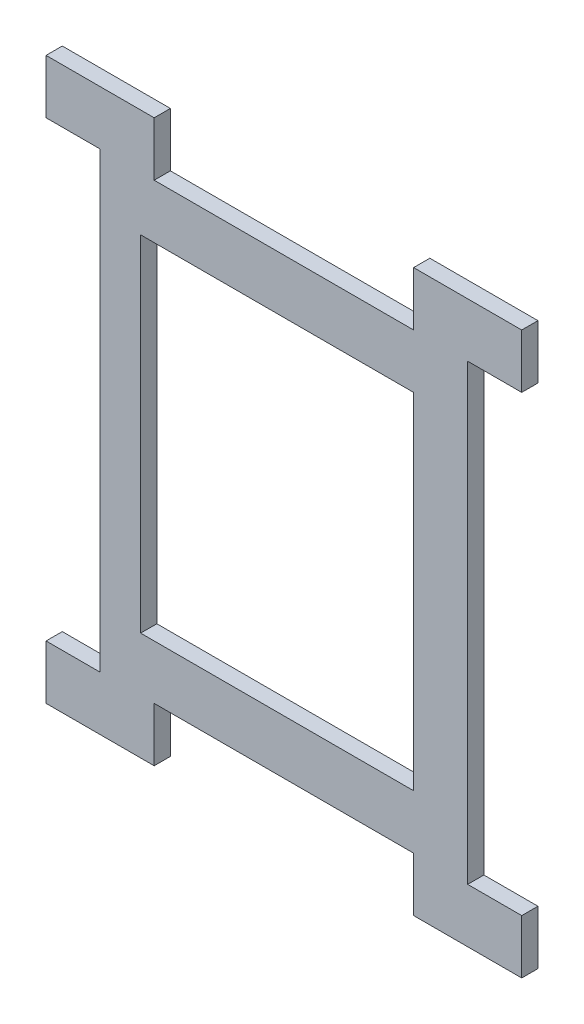
ISO-10303-21;
HEADER;
FILE_DESCRIPTION(('STEP AP214'),'2;1');
FILE_NAME('part.step','',(''),(''),'','','');
FILE_SCHEMA(('AUTOMOTIVE_DESIGN { 1 0 10303 214 1 1 1 1 }'));
ENDSEC;
DATA;
#1=APPLICATION_CONTEXT('core data for automotive mechanical design processes');
#2=APPLICATION_PROTOCOL_DEFINITION('international standard','automotive_design',2000,#1);
#3=PRODUCT_CONTEXT('',#1,'mechanical');
#4=PRODUCT('Part','Part','',(#3));
#5=PRODUCT_RELATED_PRODUCT_CATEGORY('part','',(#4));
#6=PRODUCT_DEFINITION_FORMATION('','',#4);
#7=PRODUCT_DEFINITION_CONTEXT('part definition',#1,'design');
#8=PRODUCT_DEFINITION('design','',#6,#7);
#9=PRODUCT_DEFINITION_SHAPE('','',#8);
#10=(LENGTH_UNIT() NAMED_UNIT(*) SI_UNIT(.MILLI.,.METRE.));
#11=(NAMED_UNIT(*) PLANE_ANGLE_UNIT() SI_UNIT($,.RADIAN.));
#12=(NAMED_UNIT(*) SI_UNIT($,.STERADIAN.) SOLID_ANGLE_UNIT());
#13=UNCERTAINTY_MEASURE_WITH_UNIT(LENGTH_MEASURE(1.E-05),#10,'distance_accuracy_value','');
#14=(GEOMETRIC_REPRESENTATION_CONTEXT(3) GLOBAL_UNCERTAINTY_ASSIGNED_CONTEXT((#13)) GLOBAL_UNIT_ASSIGNED_CONTEXT((#10,
#11,#12)) REPRESENTATION_CONTEXT('',''));
#15=CARTESIAN_POINT('',(0.,0.,0.));
#16=DIRECTION('',(0.,0.,1.));
#17=DIRECTION('',(1.,0.,0.));
#18=AXIS2_PLACEMENT_3D('',#15,#16,#17);
#19=CARTESIAN_POINT('',(-37.1907164276685,32.8972694424078,3.));
#20=DIRECTION('',(0.,0.,1.));
#21=DIRECTION('',(1.,0.,0.));
#22=AXIS2_PLACEMENT_3D('',#19,#20,#21);
#23=PLANE('',#22);
#24=DIRECTION('',(-1.,0.,0.));
#25=VECTOR('',#24,1.);
#26=CARTESIAN_POINT('',(-17.1907164276685,32.8972694424079,3.));
#27=LINE('',#26,#25);
#28=CARTESIAN_POINT('',(-17.1907164276685,32.8972694424079,3.));
#29=VERTEX_POINT('',#28);
#30=CARTESIAN_POINT('',(-37.1907164276685,32.8972694424078,3.));
#31=VERTEX_POINT('',#30);
#32=EDGE_CURVE('E230',#29,#31,#27,.T.);
#33=ORIENTED_EDGE('',*,*,#32,.T.);
#34=DIRECTION('',(0.,-1.,0.));
#35=VECTOR('',#34,1.);
#36=CARTESIAN_POINT('',(-37.1907164276685,32.8972694424078,3.));
#37=LINE('',#36,#35);
#38=CARTESIAN_POINT('',(-37.1907164276685,22.8972694424078,3.));
#39=VERTEX_POINT('',#38);
#40=EDGE_CURVE('E233',#31,#39,#37,.T.);
#41=ORIENTED_EDGE('',*,*,#40,.T.);
#42=DIRECTION('',(1.,0.,0.));
#43=VECTOR('',#42,1.);
#44=CARTESIAN_POINT('',(-37.1907164276685,22.8972694424078,3.));
#45=LINE('',#44,#43);
#46=CARTESIAN_POINT('',(-27.1907164276685,22.8972694424078,3.));
#47=VERTEX_POINT('',#46);
#48=EDGE_CURVE('E236',#39,#47,#45,.T.);
#49=ORIENTED_EDGE('',*,*,#48,.T.);
#50=DIRECTION('',(0.,-1.,0.));
#51=VECTOR('',#50,1.);
#52=CARTESIAN_POINT('',(-27.1907164276685,22.8972694424078,3.));
#53=LINE('',#52,#51);
#54=CARTESIAN_POINT('',(-27.1907164276685,-60.9121496064873,3.));
#55=VERTEX_POINT('',#54);
#56=EDGE_CURVE('E238',#47,#55,#53,.T.);
#57=ORIENTED_EDGE('',*,*,#56,.T.);
#58=DIRECTION('',(-1.,0.,0.));
#59=VECTOR('',#58,1.);
#60=CARTESIAN_POINT('',(-27.1907164276685,-60.9121496064873,3.));
#61=LINE('',#60,#59);
#62=CARTESIAN_POINT('',(-37.1907164276685,-60.9121496064873,3.));
#63=VERTEX_POINT('',#62);
#64=EDGE_CURVE('E240',#55,#63,#61,.T.);
#65=ORIENTED_EDGE('',*,*,#64,.T.);
#66=DIRECTION('',(0.,-1.,0.));
#67=VECTOR('',#66,1.);
#68=CARTESIAN_POINT('',(-37.1907164276685,-60.9121496064873,3.));
#69=LINE('',#68,#67);
#70=CARTESIAN_POINT('',(-37.1907164276685,-70.9121496064873,3.));
#71=VERTEX_POINT('',#70);
#72=EDGE_CURVE('E242',#63,#71,#69,.T.);
#73=ORIENTED_EDGE('',*,*,#72,.T.);
#74=DIRECTION('',(1.,0.,0.));
#75=VECTOR('',#74,1.);
#76=CARTESIAN_POINT('',(-37.1907164276685,-70.9121496064873,3.));
#77=LINE('',#76,#75);
#78=CARTESIAN_POINT('',(-17.1907164276685,-70.9121496064873,3.));
#79=VERTEX_POINT('',#78);
#80=EDGE_CURVE('E244',#71,#79,#77,.T.);
#81=ORIENTED_EDGE('',*,*,#80,.T.);
#82=DIRECTION('',(0.,1.,0.));
#83=VECTOR('',#82,1.);
#84=CARTESIAN_POINT('',(-17.1907164276685,-70.9121496064873,3.));
#85=LINE('',#84,#83);
#86=CARTESIAN_POINT('',(-17.1907164276685,-60.9121496064873,3.));
#87=VERTEX_POINT('',#86);
#88=EDGE_CURVE('E246',#79,#87,#85,.T.);
#89=ORIENTED_EDGE('',*,*,#88,.T.);
#90=DIRECTION('',(1.,0.,0.));
#91=VECTOR('',#90,1.);
#92=CARTESIAN_POINT('',(-17.1907164276685,-60.9121496064873,3.));
#93=LINE('',#92,#91);
#94=CARTESIAN_POINT('',(30.7987710064722,-60.9121496064873,3.));
#95=VERTEX_POINT('',#94);
#96=EDGE_CURVE('E248',#87,#95,#93,.T.);
#97=ORIENTED_EDGE('',*,*,#96,.T.);
#98=DIRECTION('',(0.,-1.,0.));
#99=VECTOR('',#98,1.);
#100=CARTESIAN_POINT('',(30.7987710064722,-60.9121496064873,3.));
#101=LINE('',#100,#99);
#102=CARTESIAN_POINT('',(30.7987710064722,-70.9121496064873,3.));
#103=VERTEX_POINT('',#102);
#104=EDGE_CURVE('E250',#95,#103,#101,.T.);
#105=ORIENTED_EDGE('',*,*,#104,.T.);
#106=DIRECTION('',(1.,0.,0.));
#107=VECTOR('',#106,1.);
#108=CARTESIAN_POINT('',(30.7987710064722,-70.9121496064873,3.));
#109=LINE('',#108,#107);
#110=CARTESIAN_POINT('',(50.7987710064722,-70.9121496064873,3.));
#111=VERTEX_POINT('',#110);
#112=EDGE_CURVE('E252',#103,#111,#109,.T.);
#113=ORIENTED_EDGE('',*,*,#112,.T.);
#114=DIRECTION('',(0.,1.,0.));
#115=VECTOR('',#114,1.);
#116=CARTESIAN_POINT('',(50.7987710064722,-70.9121496064873,3.));
#117=LINE('',#116,#115);
#118=CARTESIAN_POINT('',(50.7987710064722,-60.9121496064873,3.));
#119=VERTEX_POINT('',#118);
#120=EDGE_CURVE('E254',#111,#119,#117,.T.);
#121=ORIENTED_EDGE('',*,*,#120,.T.);
#122=DIRECTION('',(-1.,0.,0.));
#123=VECTOR('',#122,1.);
#124=CARTESIAN_POINT('',(50.7987710064722,-60.9121496064873,3.));
#125=LINE('',#124,#123);
#126=CARTESIAN_POINT('',(40.7987710064722,-60.9121496064873,3.));
#127=VERTEX_POINT('',#126);
#128=EDGE_CURVE('E256',#119,#127,#125,.T.);
#129=ORIENTED_EDGE('',*,*,#128,.T.);
#130=DIRECTION('',(0.,1.,0.));
#131=VECTOR('',#130,1.);
#132=CARTESIAN_POINT('',(40.7987710064722,-60.9121496064873,3.));
#133=LINE('',#132,#131);
#134=CARTESIAN_POINT('',(40.7987710064722,22.8972694424078,3.));
#135=VERTEX_POINT('',#134);
#136=EDGE_CURVE('E258',#127,#135,#133,.T.);
#137=ORIENTED_EDGE('',*,*,#136,.T.);
#138=DIRECTION('',(1.,0.,0.));
#139=VECTOR('',#138,1.);
#140=CARTESIAN_POINT('',(40.7987710064722,22.8972694424078,3.));
#141=LINE('',#140,#139);
#142=CARTESIAN_POINT('',(50.7987710064722,22.8972694424078,3.));
#143=VERTEX_POINT('',#142);
#144=EDGE_CURVE('E260',#135,#143,#141,.T.);
#145=ORIENTED_EDGE('',*,*,#144,.T.);
#146=DIRECTION('',(0.,1.,0.));
#147=VECTOR('',#146,1.);
#148=CARTESIAN_POINT('',(50.7987710064722,22.8972694424078,3.));
#149=LINE('',#148,#147);
#150=CARTESIAN_POINT('',(50.7987710064722,32.8972694424078,3.));
#151=VERTEX_POINT('',#150);
#152=EDGE_CURVE('E262',#143,#151,#149,.T.);
#153=ORIENTED_EDGE('',*,*,#152,.T.);
#154=DIRECTION('',(-1.,0.,0.));
#155=VECTOR('',#154,1.);
#156=CARTESIAN_POINT('',(50.7987710064722,32.8972694424078,3.));
#157=LINE('',#156,#155);
#158=CARTESIAN_POINT('',(30.7987710064722,32.8972694424078,3.));
#159=VERTEX_POINT('',#158);
#160=EDGE_CURVE('E264',#151,#159,#157,.T.);
#161=ORIENTED_EDGE('',*,*,#160,.T.);
#162=DIRECTION('',(0.,-1.,0.));
#163=VECTOR('',#162,1.);
#164=CARTESIAN_POINT('',(30.7987710064722,32.8972694424078,3.));
#165=LINE('',#164,#163);
#166=CARTESIAN_POINT('',(30.7987710064722,22.8972694424078,3.));
#167=VERTEX_POINT('',#166);
#168=EDGE_CURVE('E266',#159,#167,#165,.T.);
#169=ORIENTED_EDGE('',*,*,#168,.T.);
#170=DIRECTION('',(-1.,0.,0.));
#171=VECTOR('',#170,1.);
#172=CARTESIAN_POINT('',(30.7987710064722,22.8972694424078,3.));
#173=LINE('',#172,#171);
#174=CARTESIAN_POINT('',(-17.1907164276685,22.8972694424078,3.));
#175=VERTEX_POINT('',#174);
#176=EDGE_CURVE('E268',#167,#175,#173,.T.);
#177=ORIENTED_EDGE('',*,*,#176,.T.);
#178=DIRECTION('',(0.,1.,0.));
#179=VECTOR('',#178,1.);
#180=CARTESIAN_POINT('',(-17.1907164276685,22.8972694424078,3.));
#181=LINE('',#180,#179);
#182=EDGE_CURVE('E270',#175,#29,#181,.T.);
#183=ORIENTED_EDGE('',*,*,#182,.T.);
#184=EDGE_LOOP('',(#33,#41,#49,#57,#65,#73,#81,#89,#97,#105,#113,#121,#129,#137,#145,#153,#161,
#169,#177,#183));
#185=FACE_BOUND('',#184,.T.);
#186=DIRECTION('',(-1.,0.,0.));
#187=VECTOR('',#186,1.);
#188=CARTESIAN_POINT('',(-19.6970646101533,12.8972694424078,3.));
#189=LINE('',#188,#187);
#190=CARTESIAN_POINT('',(30.7987710064722,12.8972694424078,3.));
#191=VERTEX_POINT('',#190);
#192=CARTESIAN_POINT('',(-19.6970646101533,12.8972694424078,3.));
#193=VERTEX_POINT('',#192);
#194=EDGE_CURVE('E202',#191,#193,#189,.T.);
#195=ORIENTED_EDGE('',*,*,#194,.F.);
#196=DIRECTION('',(0.,1.,0.));
#197=VECTOR('',#196,1.);
#198=CARTESIAN_POINT('',(30.7987710064722,12.8972694424078,3.));
#199=LINE('',#198,#197);
#200=CARTESIAN_POINT('',(30.7987710064722,-50.9121496064873,3.));
#201=VERTEX_POINT('',#200);
#202=EDGE_CURVE('E194',#201,#191,#199,.T.);
#203=ORIENTED_EDGE('',*,*,#202,.F.);
#204=DIRECTION('',(1.,0.,0.));
#205=VECTOR('',#204,1.);
#206=CARTESIAN_POINT('',(-19.6970646101532,-50.9121496064873,3.));
#207=LINE('',#206,#205);
#208=CARTESIAN_POINT('',(-19.6970646101532,-50.9121496064873,3.));
#209=VERTEX_POINT('',#208);
#210=EDGE_CURVE('E216',#209,#201,#207,.T.);
#211=ORIENTED_EDGE('',*,*,#210,.F.);
#212=DIRECTION('',(0.,-1.,0.));
#213=VECTOR('',#212,1.);
#214=CARTESIAN_POINT('',(-19.6970646101533,12.8972694424078,3.));
#215=LINE('',#214,#213);
#216=EDGE_CURVE('E214',#193,#209,#215,.T.);
#217=ORIENTED_EDGE('',*,*,#216,.F.);
#218=EDGE_LOOP('',(#195,#203,#211,#217));
#219=FACE_BOUND('',#218,.T.);
#220=ADVANCED_FACE('F33',(#185,#219),#23,.T.);
#221=CARTESIAN_POINT('',(-37.1907164276685,32.8972694424078,0.));
#222=DIRECTION('',(0.,0.,1.));
#223=DIRECTION('',(1.,0.,0.));
#224=AXIS2_PLACEMENT_3D('',#221,#222,#223);
#225=PLANE('',#224);
#226=DIRECTION('',(-1.,0.,0.));
#227=VECTOR('',#226,1.);
#228=CARTESIAN_POINT('',(-17.1907164276685,32.8972694424079,0.));
#229=LINE('',#228,#227);
#230=CARTESIAN_POINT('',(-17.1907164276685,32.8972694424079,0.));
#231=VERTEX_POINT('',#230);
#232=CARTESIAN_POINT('',(-37.1907164276685,32.8972694424078,0.));
#233=VERTEX_POINT('',#232);
#234=EDGE_CURVE('E210',#231,#233,#229,.T.);
#235=ORIENTED_EDGE('',*,*,#234,.F.);
#236=DIRECTION('',(0.,1.,0.));
#237=VECTOR('',#236,1.);
#238=CARTESIAN_POINT('',(-17.1907164276685,22.8972694424078,0.));
#239=LINE('',#238,#237);
#240=CARTESIAN_POINT('',(-17.1907164276685,22.8972694424078,0.));
#241=VERTEX_POINT('',#240);
#242=EDGE_CURVE('E234',#241,#231,#239,.T.);
#243=ORIENTED_EDGE('',*,*,#242,.F.);
#244=DIRECTION('',(-1.,0.,0.));
#245=VECTOR('',#244,1.);
#246=CARTESIAN_POINT('',(30.7987710064722,22.8972694424078,0.));
#247=LINE('',#246,#245);
#248=CARTESIAN_POINT('',(30.7987710064722,22.8972694424078,0.));
#249=VERTEX_POINT('',#248);
#250=EDGE_CURVE('E309',#249,#241,#247,.T.);
#251=ORIENTED_EDGE('',*,*,#250,.F.);
#252=DIRECTION('',(0.,-1.,0.));
#253=VECTOR('',#252,1.);
#254=CARTESIAN_POINT('',(30.7987710064722,32.8972694424078,0.));
#255=LINE('',#254,#253);
#256=CARTESIAN_POINT('',(30.7987710064722,32.8972694424078,0.));
#257=VERTEX_POINT('',#256);
#258=EDGE_CURVE('E307',#257,#249,#255,.T.);
#259=ORIENTED_EDGE('',*,*,#258,.F.);
#260=DIRECTION('',(-1.,0.,0.));
#261=VECTOR('',#260,1.);
#262=CARTESIAN_POINT('',(50.7987710064722,32.8972694424078,0.));
#263=LINE('',#262,#261);
#264=CARTESIAN_POINT('',(50.7987710064722,32.8972694424078,0.));
#265=VERTEX_POINT('',#264);
#266=EDGE_CURVE('E305',#265,#257,#263,.T.);
#267=ORIENTED_EDGE('',*,*,#266,.F.);
#268=DIRECTION('',(0.,1.,0.));
#269=VECTOR('',#268,1.);
#270=CARTESIAN_POINT('',(50.7987710064722,22.8972694424078,0.));
#271=LINE('',#270,#269);
#272=CARTESIAN_POINT('',(50.7987710064722,22.8972694424078,0.));
#273=VERTEX_POINT('',#272);
#274=EDGE_CURVE('E303',#273,#265,#271,.T.);
#275=ORIENTED_EDGE('',*,*,#274,.F.);
#276=DIRECTION('',(1.,0.,0.));
#277=VECTOR('',#276,1.);
#278=CARTESIAN_POINT('',(40.7987710064722,22.8972694424078,0.));
#279=LINE('',#278,#277);
#280=CARTESIAN_POINT('',(40.7987710064722,22.8972694424078,0.));
#281=VERTEX_POINT('',#280);
#282=EDGE_CURVE('E301',#281,#273,#279,.T.);
#283=ORIENTED_EDGE('',*,*,#282,.F.);
#284=DIRECTION('',(0.,1.,0.));
#285=VECTOR('',#284,1.);
#286=CARTESIAN_POINT('',(40.7987710064722,-60.9121496064873,0.));
#287=LINE('',#286,#285);
#288=CARTESIAN_POINT('',(40.7987710064722,-60.9121496064873,0.));
#289=VERTEX_POINT('',#288);
#290=EDGE_CURVE('E299',#289,#281,#287,.T.);
#291=ORIENTED_EDGE('',*,*,#290,.F.);
#292=DIRECTION('',(-1.,0.,0.));
#293=VECTOR('',#292,1.);
#294=CARTESIAN_POINT('',(50.7987710064722,-60.9121496064873,0.));
#295=LINE('',#294,#293);
#296=CARTESIAN_POINT('',(50.7987710064722,-60.9121496064873,0.));
#297=VERTEX_POINT('',#296);
#298=EDGE_CURVE('E297',#297,#289,#295,.T.);
#299=ORIENTED_EDGE('',*,*,#298,.F.);
#300=DIRECTION('',(0.,1.,0.));
#301=VECTOR('',#300,1.);
#302=CARTESIAN_POINT('',(50.7987710064722,-70.9121496064873,0.));
#303=LINE('',#302,#301);
#304=CARTESIAN_POINT('',(50.7987710064722,-70.9121496064873,0.));
#305=VERTEX_POINT('',#304);
#306=EDGE_CURVE('E295',#305,#297,#303,.T.);
#307=ORIENTED_EDGE('',*,*,#306,.F.);
#308=DIRECTION('',(1.,0.,0.));
#309=VECTOR('',#308,1.);
#310=CARTESIAN_POINT('',(30.7987710064722,-70.9121496064873,0.));
#311=LINE('',#310,#309);
#312=CARTESIAN_POINT('',(30.7987710064722,-70.9121496064873,0.));
#313=VERTEX_POINT('',#312);
#314=EDGE_CURVE('E293',#313,#305,#311,.T.);
#315=ORIENTED_EDGE('',*,*,#314,.F.);
#316=DIRECTION('',(0.,-1.,0.));
#317=VECTOR('',#316,1.);
#318=CARTESIAN_POINT('',(30.7987710064722,-60.9121496064873,0.));
#319=LINE('',#318,#317);
#320=CARTESIAN_POINT('',(30.7987710064722,-60.9121496064873,0.));
#321=VERTEX_POINT('',#320);
#322=EDGE_CURVE('E291',#321,#313,#319,.T.);
#323=ORIENTED_EDGE('',*,*,#322,.F.);
#324=DIRECTION('',(1.,0.,0.));
#325=VECTOR('',#324,1.);
#326=CARTESIAN_POINT('',(-17.1907164276685,-60.9121496064873,0.));
#327=LINE('',#326,#325);
#328=CARTESIAN_POINT('',(-17.1907164276685,-60.9121496064873,0.));
#329=VERTEX_POINT('',#328);
#330=EDGE_CURVE('E289',#329,#321,#327,.T.);
#331=ORIENTED_EDGE('',*,*,#330,.F.);
#332=DIRECTION('',(0.,1.,0.));
#333=VECTOR('',#332,1.);
#334=CARTESIAN_POINT('',(-17.1907164276685,-70.9121496064873,0.));
#335=LINE('',#334,#333);
#336=CARTESIAN_POINT('',(-17.1907164276685,-70.9121496064873,0.));
#337=VERTEX_POINT('',#336);
#338=EDGE_CURVE('E287',#337,#329,#335,.T.);
#339=ORIENTED_EDGE('',*,*,#338,.F.);
#340=DIRECTION('',(1.,0.,0.));
#341=VECTOR('',#340,1.);
#342=CARTESIAN_POINT('',(-37.1907164276685,-70.9121496064873,0.));
#343=LINE('',#342,#341);
#344=CARTESIAN_POINT('',(-37.1907164276685,-70.9121496064873,0.));
#345=VERTEX_POINT('',#344);
#346=EDGE_CURVE('E285',#345,#337,#343,.T.);
#347=ORIENTED_EDGE('',*,*,#346,.F.);
#348=DIRECTION('',(0.,-1.,0.));
#349=VECTOR('',#348,1.);
#350=CARTESIAN_POINT('',(-37.1907164276685,-60.9121496064873,0.));
#351=LINE('',#350,#349);
#352=CARTESIAN_POINT('',(-37.1907164276685,-60.9121496064873,0.));
#353=VERTEX_POINT('',#352);
#354=EDGE_CURVE('E283',#353,#345,#351,.T.);
#355=ORIENTED_EDGE('',*,*,#354,.F.);
#356=DIRECTION('',(-1.,0.,0.));
#357=VECTOR('',#356,1.);
#358=CARTESIAN_POINT('',(-27.1907164276685,-60.9121496064873,0.));
#359=LINE('',#358,#357);
#360=CARTESIAN_POINT('',(-27.1907164276685,-60.9121496064873,0.));
#361=VERTEX_POINT('',#360);
#362=EDGE_CURVE('E281',#361,#353,#359,.T.);
#363=ORIENTED_EDGE('',*,*,#362,.F.);
#364=DIRECTION('',(0.,-1.,0.));
#365=VECTOR('',#364,1.);
#366=CARTESIAN_POINT('',(-27.1907164276685,22.8972694424078,0.));
#367=LINE('',#366,#365);
#368=CARTESIAN_POINT('',(-27.1907164276685,22.8972694424078,0.));
#369=VERTEX_POINT('',#368);
#370=EDGE_CURVE('E279',#369,#361,#367,.T.);
#371=ORIENTED_EDGE('',*,*,#370,.F.);
#372=DIRECTION('',(1.,0.,0.));
#373=VECTOR('',#372,1.);
#374=CARTESIAN_POINT('',(-37.1907164276685,22.8972694424078,0.));
#375=LINE('',#374,#373);
#376=CARTESIAN_POINT('',(-37.1907164276685,22.8972694424078,0.));
#377=VERTEX_POINT('',#376);
#378=EDGE_CURVE('E277',#377,#369,#375,.T.);
#379=ORIENTED_EDGE('',*,*,#378,.F.);
#380=DIRECTION('',(0.,-1.,0.));
#381=VECTOR('',#380,1.);
#382=CARTESIAN_POINT('',(-37.1907164276685,32.8972694424078,0.));
#383=LINE('',#382,#381);
#384=EDGE_CURVE('E275',#233,#377,#383,.T.);
#385=ORIENTED_EDGE('',*,*,#384,.F.);
#386=EDGE_LOOP('',(#235,#243,#251,#259,#267,#275,#283,#291,#299,#307,#315,#323,#331,#339,#347,
#355,#363,#371,#379,#385));
#387=FACE_BOUND('',#386,.T.);
#388=DIRECTION('',(0.,1.,0.));
#389=VECTOR('',#388,1.);
#390=CARTESIAN_POINT('',(30.7987710064722,12.8972694424078,0.));
#391=LINE('',#390,#389);
#392=CARTESIAN_POINT('',(30.7987710064722,-50.9121496064873,0.));
#393=VERTEX_POINT('',#392);
#394=CARTESIAN_POINT('',(30.7987710064722,12.8972694424078,0.));
#395=VERTEX_POINT('',#394);
#396=EDGE_CURVE('E56',#393,#395,#391,.T.);
#397=ORIENTED_EDGE('',*,*,#396,.T.);
#398=DIRECTION('',(-1.,0.,0.));
#399=VECTOR('',#398,1.);
#400=CARTESIAN_POINT('',(-19.6970646101533,12.8972694424078,0.));
#401=LINE('',#400,#399);
#402=CARTESIAN_POINT('',(-19.6970646101533,12.8972694424078,0.));
#403=VERTEX_POINT('',#402);
#404=EDGE_CURVE('E209',#395,#403,#401,.T.);
#405=ORIENTED_EDGE('',*,*,#404,.T.);
#406=DIRECTION('',(0.,-1.,0.));
#407=VECTOR('',#406,1.);
#408=CARTESIAN_POINT('',(-19.6970646101533,12.8972694424078,0.));
#409=LINE('',#408,#407);
#410=CARTESIAN_POINT('',(-19.6970646101532,-50.9121496064873,0.));
#411=VERTEX_POINT('',#410);
#412=EDGE_CURVE('E222',#403,#411,#409,.T.);
#413=ORIENTED_EDGE('',*,*,#412,.T.);
#414=DIRECTION('',(1.,0.,0.));
#415=VECTOR('',#414,1.);
#416=CARTESIAN_POINT('',(-19.6970646101532,-50.9121496064873,0.));
#417=LINE('',#416,#415);
#418=EDGE_CURVE('E203',#411,#393,#417,.T.);
#419=ORIENTED_EDGE('',*,*,#418,.T.);
#420=EDGE_LOOP('',(#397,#405,#413,#419));
#421=FACE_BOUND('',#420,.T.);
#422=ADVANCED_FACE('F375',(#387,#421),#225,.F.);
#423=CARTESIAN_POINT('',(-17.1907164276685,32.8972694424079,3.));
#424=DIRECTION('',(0.,-1.,0.));
#425=DIRECTION('',(1.,0.,0.));
#426=AXIS2_PLACEMENT_3D('',#423,#424,#425);
#427=PLANE('',#426);
#428=ORIENTED_EDGE('',*,*,#234,.T.);
#429=DIRECTION('',(0.,0.,-1.));
#430=VECTOR('',#429,1.);
#431=CARTESIAN_POINT('',(-37.1907164276685,32.8972694424078,3.));
#432=LINE('',#431,#430);
#433=EDGE_CURVE('E11',#31,#233,#432,.T.);
#434=ORIENTED_EDGE('',*,*,#433,.F.);
#435=ORIENTED_EDGE('',*,*,#32,.F.);
#436=DIRECTION('',(0.,0.,-1.));
#437=VECTOR('',#436,1.);
#438=CARTESIAN_POINT('',(-17.1907164276685,32.8972694424079,3.));
#439=LINE('',#438,#437);
#440=EDGE_CURVE('E272',#29,#231,#439,.T.);
#441=ORIENTED_EDGE('',*,*,#440,.T.);
#442=EDGE_LOOP('',(#428,#434,#435,#441));
#443=FACE_BOUND('',#442,.T.);
#444=ADVANCED_FACE('F35',(#443),#427,.F.);
#445=CARTESIAN_POINT('',(-37.1907164276685,32.8972694424078,3.));
#446=DIRECTION('',(1.,0.,0.));
#447=DIRECTION('',(0.,0.,-1.));
#448=AXIS2_PLACEMENT_3D('',#445,#446,#447);
#449=PLANE('',#448);
#450=ORIENTED_EDGE('',*,*,#384,.T.);
#451=DIRECTION('',(0.,0.,-1.));
#452=VECTOR('',#451,1.);
#453=CARTESIAN_POINT('',(-37.1907164276685,22.8972694424078,3.));
#454=LINE('',#453,#452);
#455=EDGE_CURVE('E41',#39,#377,#454,.T.);
#456=ORIENTED_EDGE('',*,*,#455,.F.);
#457=ORIENTED_EDGE('',*,*,#40,.F.);
#458=ORIENTED_EDGE('',*,*,#433,.T.);
#459=EDGE_LOOP('',(#450,#456,#457,#458));
#460=FACE_BOUND('',#459,.T.);
#461=ADVANCED_FACE('F392',(#460),#449,.F.);
#462=CARTESIAN_POINT('',(-37.1907164276685,22.8972694424078,3.));
#463=DIRECTION('',(0.,1.,0.));
#464=DIRECTION('',(0.,0.,1.));
#465=AXIS2_PLACEMENT_3D('',#462,#463,#464);
#466=PLANE('',#465);
#467=ORIENTED_EDGE('',*,*,#378,.T.);
#468=DIRECTION('',(0.,0.,-1.));
#469=VECTOR('',#468,1.);
#470=CARTESIAN_POINT('',(-27.1907164276685,22.8972694424078,3.));
#471=LINE('',#470,#469);
#472=EDGE_CURVE('E362',#47,#369,#471,.T.);
#473=ORIENTED_EDGE('',*,*,#472,.F.);
#474=ORIENTED_EDGE('',*,*,#48,.F.);
#475=ORIENTED_EDGE('',*,*,#455,.T.);
#476=EDGE_LOOP('',(#467,#473,#474,#475));
#477=FACE_BOUND('',#476,.T.);
#478=ADVANCED_FACE('F369',(#477),#466,.F.);
#479=CARTESIAN_POINT('',(-27.1907164276685,22.8972694424078,3.));
#480=DIRECTION('',(1.,0.,0.));
#481=DIRECTION('',(0.,1.,0.));
#482=AXIS2_PLACEMENT_3D('',#479,#480,#481);
#483=PLANE('',#482);
#484=ORIENTED_EDGE('',*,*,#370,.T.);
#485=DIRECTION('',(0.,0.,-1.));
#486=VECTOR('',#485,1.);
#487=CARTESIAN_POINT('',(-27.1907164276685,-60.9121496064873,3.));
#488=LINE('',#487,#486);
#489=EDGE_CURVE('E359',#55,#361,#488,.T.);
#490=ORIENTED_EDGE('',*,*,#489,.F.);
#491=ORIENTED_EDGE('',*,*,#56,.F.);
#492=ORIENTED_EDGE('',*,*,#472,.T.);
#493=EDGE_LOOP('',(#484,#490,#491,#492));
#494=FACE_BOUND('',#493,.T.);
#495=ADVANCED_FACE('F381',(#494),#483,.F.);
#496=CARTESIAN_POINT('',(-27.1907164276685,-60.9121496064873,3.));
#497=DIRECTION('',(0.,-1.,0.));
#498=DIRECTION('',(1.,0.,0.));
#499=AXIS2_PLACEMENT_3D('',#496,#497,#498);
#500=PLANE('',#499);
#501=ORIENTED_EDGE('',*,*,#362,.T.);
#502=DIRECTION('',(0.,0.,-1.));
#503=VECTOR('',#502,1.);
#504=CARTESIAN_POINT('',(-37.1907164276685,-60.9121496064873,3.));
#505=LINE('',#504,#503);
#506=EDGE_CURVE('E356',#63,#353,#505,.T.);
#507=ORIENTED_EDGE('',*,*,#506,.F.);
#508=ORIENTED_EDGE('',*,*,#64,.F.);
#509=ORIENTED_EDGE('',*,*,#489,.T.);
#510=EDGE_LOOP('',(#501,#507,#508,#509));
#511=FACE_BOUND('',#510,.T.);
#512=ADVANCED_FACE('F385',(#511),#500,.F.);
#513=CARTESIAN_POINT('',(-37.1907164276685,-60.9121496064873,3.));
#514=DIRECTION('',(1.,0.,0.));
#515=DIRECTION('',(0.,0.,-1.));
#516=AXIS2_PLACEMENT_3D('',#513,#514,#515);
#517=PLANE('',#516);
#518=ORIENTED_EDGE('',*,*,#354,.T.);
#519=DIRECTION('',(0.,0.,-1.));
#520=VECTOR('',#519,1.);
#521=CARTESIAN_POINT('',(-37.1907164276685,-70.9121496064873,3.));
#522=LINE('',#521,#520);
#523=EDGE_CURVE('E353',#71,#345,#522,.T.);
#524=ORIENTED_EDGE('',*,*,#523,.F.);
#525=ORIENTED_EDGE('',*,*,#72,.F.);
#526=ORIENTED_EDGE('',*,*,#506,.T.);
#527=EDGE_LOOP('',(#518,#524,#525,#526));
#528=FACE_BOUND('',#527,.T.);
#529=ADVANCED_FACE('F465',(#528),#517,.F.);
#530=CARTESIAN_POINT('',(-37.1907164276685,-70.9121496064873,3.));
#531=DIRECTION('',(0.,1.,0.));
#532=DIRECTION('',(0.,0.,1.));
#533=AXIS2_PLACEMENT_3D('',#530,#531,#532);
#534=PLANE('',#533);
#535=ORIENTED_EDGE('',*,*,#346,.T.);
#536=DIRECTION('',(0.,0.,-1.));
#537=VECTOR('',#536,1.);
#538=CARTESIAN_POINT('',(-17.1907164276685,-70.9121496064873,3.));
#539=LINE('',#538,#537);
#540=EDGE_CURVE('E350',#79,#337,#539,.T.);
#541=ORIENTED_EDGE('',*,*,#540,.F.);
#542=ORIENTED_EDGE('',*,*,#80,.F.);
#543=ORIENTED_EDGE('',*,*,#523,.T.);
#544=EDGE_LOOP('',(#535,#541,#542,#543));
#545=FACE_BOUND('',#544,.T.);
#546=ADVANCED_FACE('F463',(#545),#534,.F.);
#547=CARTESIAN_POINT('',(-17.1907164276685,-70.9121496064873,3.));
#548=DIRECTION('',(-1.,0.,0.));
#549=DIRECTION('',(0.,-1.,0.));
#550=AXIS2_PLACEMENT_3D('',#547,#548,#549);
#551=PLANE('',#550);
#552=ORIENTED_EDGE('',*,*,#338,.T.);
#553=DIRECTION('',(0.,0.,-1.));
#554=VECTOR('',#553,1.);
#555=CARTESIAN_POINT('',(-17.1907164276685,-60.9121496064873,3.));
#556=LINE('',#555,#554);
#557=EDGE_CURVE('E347',#87,#329,#556,.T.);
#558=ORIENTED_EDGE('',*,*,#557,.F.);
#559=ORIENTED_EDGE('',*,*,#88,.F.);
#560=ORIENTED_EDGE('',*,*,#540,.T.);
#561=EDGE_LOOP('',(#552,#558,#559,#560));
#562=FACE_BOUND('',#561,.T.);
#563=ADVANCED_FACE('F458',(#562),#551,.F.);
#564=CARTESIAN_POINT('',(-17.1907164276685,-60.9121496064873,3.));
#565=DIRECTION('',(0.,1.,0.));
#566=DIRECTION('',(0.,0.,1.));
#567=AXIS2_PLACEMENT_3D('',#564,#565,#566);
#568=PLANE('',#567);
#569=ORIENTED_EDGE('',*,*,#330,.T.);
#570=DIRECTION('',(0.,0.,-1.));
#571=VECTOR('',#570,1.);
#572=CARTESIAN_POINT('',(30.7987710064722,-60.9121496064873,3.));
#573=LINE('',#572,#571);
#574=EDGE_CURVE('E344',#95,#321,#573,.T.);
#575=ORIENTED_EDGE('',*,*,#574,.F.);
#576=ORIENTED_EDGE('',*,*,#96,.F.);
#577=ORIENTED_EDGE('',*,*,#557,.T.);
#578=EDGE_LOOP('',(#569,#575,#576,#577));
#579=FACE_BOUND('',#578,.T.);
#580=ADVANCED_FACE('F453',(#579),#568,.F.);
#581=CARTESIAN_POINT('',(30.7987710064722,-60.9121496064873,3.));
#582=DIRECTION('',(1.,0.,0.));
#583=DIRECTION('',(0.,1.,0.));
#584=AXIS2_PLACEMENT_3D('',#581,#582,#583);
#585=PLANE('',#584);
#586=ORIENTED_EDGE('',*,*,#322,.T.);
#587=DIRECTION('',(0.,0.,-1.));
#588=VECTOR('',#587,1.);
#589=CARTESIAN_POINT('',(30.7987710064722,-70.9121496064873,3.));
#590=LINE('',#589,#588);
#591=EDGE_CURVE('E341',#103,#313,#590,.T.);
#592=ORIENTED_EDGE('',*,*,#591,.F.);
#593=ORIENTED_EDGE('',*,*,#104,.F.);
#594=ORIENTED_EDGE('',*,*,#574,.T.);
#595=EDGE_LOOP('',(#586,#592,#593,#594));
#596=FACE_BOUND('',#595,.T.);
#597=ADVANCED_FACE('F449',(#596),#585,.F.);
#598=CARTESIAN_POINT('',(30.7987710064722,-70.9121496064873,3.));
#599=DIRECTION('',(0.,1.,0.));
#600=DIRECTION('',(0.,0.,1.));
#601=AXIS2_PLACEMENT_3D('',#598,#599,#600);
#602=PLANE('',#601);
#603=ORIENTED_EDGE('',*,*,#314,.T.);
#604=DIRECTION('',(0.,0.,-1.));
#605=VECTOR('',#604,1.);
#606=CARTESIAN_POINT('',(50.7987710064722,-70.9121496064873,3.));
#607=LINE('',#606,#605);
#608=EDGE_CURVE('E338',#111,#305,#607,.T.);
#609=ORIENTED_EDGE('',*,*,#608,.F.);
#610=ORIENTED_EDGE('',*,*,#112,.F.);
#611=ORIENTED_EDGE('',*,*,#591,.T.);
#612=EDGE_LOOP('',(#603,#609,#610,#611));
#613=FACE_BOUND('',#612,.T.);
#614=ADVANCED_FACE('F444',(#613),#602,.F.);
#615=CARTESIAN_POINT('',(50.7987710064722,-70.9121496064873,3.));
#616=DIRECTION('',(-1.,0.,0.));
#617=DIRECTION('',(0.,0.,1.));
#618=AXIS2_PLACEMENT_3D('',#615,#616,#617);
#619=PLANE('',#618);
#620=ORIENTED_EDGE('',*,*,#306,.T.);
#621=DIRECTION('',(0.,0.,-1.));
#622=VECTOR('',#621,1.);
#623=CARTESIAN_POINT('',(50.7987710064722,-60.9121496064873,3.));
#624=LINE('',#623,#622);
#625=EDGE_CURVE('E335',#119,#297,#624,.T.);
#626=ORIENTED_EDGE('',*,*,#625,.F.);
#627=ORIENTED_EDGE('',*,*,#120,.F.);
#628=ORIENTED_EDGE('',*,*,#608,.T.);
#629=EDGE_LOOP('',(#620,#626,#627,#628));
#630=FACE_BOUND('',#629,.T.);
#631=ADVANCED_FACE('F438',(#630),#619,.F.);
#632=CARTESIAN_POINT('',(50.7987710064722,-60.9121496064873,3.));
#633=DIRECTION('',(0.,-1.,0.));
#634=DIRECTION('',(0.,0.,-1.));
#635=AXIS2_PLACEMENT_3D('',#632,#633,#634);
#636=PLANE('',#635);
#637=ORIENTED_EDGE('',*,*,#298,.T.);
#638=DIRECTION('',(0.,0.,-1.));
#639=VECTOR('',#638,1.);
#640=CARTESIAN_POINT('',(40.7987710064722,-60.9121496064873,3.));
#641=LINE('',#640,#639);
#642=EDGE_CURVE('E332',#127,#289,#641,.T.);
#643=ORIENTED_EDGE('',*,*,#642,.F.);
#644=ORIENTED_EDGE('',*,*,#128,.F.);
#645=ORIENTED_EDGE('',*,*,#625,.T.);
#646=EDGE_LOOP('',(#637,#643,#644,#645));
#647=FACE_BOUND('',#646,.T.);
#648=ADVANCED_FACE('F434',(#647),#636,.F.);
#649=CARTESIAN_POINT('',(40.7987710064722,-60.9121496064873,3.));
#650=DIRECTION('',(-1.,0.,0.));
#651=DIRECTION('',(0.,0.,1.));
#652=AXIS2_PLACEMENT_3D('',#649,#650,#651);
#653=PLANE('',#652);
#654=ORIENTED_EDGE('',*,*,#290,.T.);
#655=DIRECTION('',(0.,0.,-1.));
#656=VECTOR('',#655,1.);
#657=CARTESIAN_POINT('',(40.7987710064722,22.8972694424078,3.));
#658=LINE('',#657,#656);
#659=EDGE_CURVE('E329',#135,#281,#658,.T.);
#660=ORIENTED_EDGE('',*,*,#659,.F.);
#661=ORIENTED_EDGE('',*,*,#136,.F.);
#662=ORIENTED_EDGE('',*,*,#642,.T.);
#663=EDGE_LOOP('',(#654,#660,#661,#662));
#664=FACE_BOUND('',#663,.T.);
#665=ADVANCED_FACE('F429',(#664),#653,.F.);
#666=CARTESIAN_POINT('',(40.7987710064722,22.8972694424078,3.));
#667=DIRECTION('',(0.,1.,0.));
#668=DIRECTION('',(0.,0.,1.));
#669=AXIS2_PLACEMENT_3D('',#666,#667,#668);
#670=PLANE('',#669);
#671=ORIENTED_EDGE('',*,*,#282,.T.);
#672=DIRECTION('',(0.,0.,-1.));
#673=VECTOR('',#672,1.);
#674=CARTESIAN_POINT('',(50.7987710064722,22.8972694424078,3.));
#675=LINE('',#674,#673);
#676=EDGE_CURVE('E326',#143,#273,#675,.T.);
#677=ORIENTED_EDGE('',*,*,#676,.F.);
#678=ORIENTED_EDGE('',*,*,#144,.F.);
#679=ORIENTED_EDGE('',*,*,#659,.T.);
#680=EDGE_LOOP('',(#671,#677,#678,#679));
#681=FACE_BOUND('',#680,.T.);
#682=ADVANCED_FACE('F423',(#681),#670,.F.);
#683=CARTESIAN_POINT('',(50.7987710064722,22.8972694424078,3.));
#684=DIRECTION('',(-1.,0.,0.));
#685=DIRECTION('',(0.,0.,1.));
#686=AXIS2_PLACEMENT_3D('',#683,#684,#685);
#687=PLANE('',#686);
#688=ORIENTED_EDGE('',*,*,#274,.T.);
#689=DIRECTION('',(0.,0.,-1.));
#690=VECTOR('',#689,1.);
#691=CARTESIAN_POINT('',(50.7987710064722,32.8972694424078,3.));
#692=LINE('',#691,#690);
#693=EDGE_CURVE('E323',#151,#265,#692,.T.);
#694=ORIENTED_EDGE('',*,*,#693,.F.);
#695=ORIENTED_EDGE('',*,*,#152,.F.);
#696=ORIENTED_EDGE('',*,*,#676,.T.);
#697=EDGE_LOOP('',(#688,#694,#695,#696));
#698=FACE_BOUND('',#697,.T.);
#699=ADVANCED_FACE('F419',(#698),#687,.F.);
#700=CARTESIAN_POINT('',(50.7987710064722,32.8972694424078,3.));
#701=DIRECTION('',(0.,-1.,0.));
#702=DIRECTION('',(1.,0.,0.));
#703=AXIS2_PLACEMENT_3D('',#700,#701,#702);
#704=PLANE('',#703);
#705=ORIENTED_EDGE('',*,*,#266,.T.);
#706=DIRECTION('',(0.,0.,-1.));
#707=VECTOR('',#706,1.);
#708=CARTESIAN_POINT('',(30.7987710064722,32.8972694424078,3.));
#709=LINE('',#708,#707);
#710=EDGE_CURVE('E320',#159,#257,#709,.T.);
#711=ORIENTED_EDGE('',*,*,#710,.F.);
#712=ORIENTED_EDGE('',*,*,#160,.F.);
#713=ORIENTED_EDGE('',*,*,#693,.T.);
#714=EDGE_LOOP('',(#705,#711,#712,#713));
#715=FACE_BOUND('',#714,.T.);
#716=ADVANCED_FACE('F414',(#715),#704,.F.);
#717=CARTESIAN_POINT('',(30.7987710064722,32.8972694424078,3.));
#718=DIRECTION('',(1.,0.,0.));
#719=DIRECTION('',(0.,1.,0.));
#720=AXIS2_PLACEMENT_3D('',#717,#718,#719);
#721=PLANE('',#720);
#722=ORIENTED_EDGE('',*,*,#258,.T.);
#723=DIRECTION('',(0.,0.,-1.));
#724=VECTOR('',#723,1.);
#725=CARTESIAN_POINT('',(30.7987710064722,22.8972694424078,3.));
#726=LINE('',#725,#724);
#727=EDGE_CURVE('E317',#167,#249,#726,.T.);
#728=ORIENTED_EDGE('',*,*,#727,.F.);
#729=ORIENTED_EDGE('',*,*,#168,.F.);
#730=ORIENTED_EDGE('',*,*,#710,.T.);
#731=EDGE_LOOP('',(#722,#728,#729,#730));
#732=FACE_BOUND('',#731,.T.);
#733=ADVANCED_FACE('F408',(#732),#721,.F.);
#734=CARTESIAN_POINT('',(30.7987710064722,22.8972694424078,3.));
#735=DIRECTION('',(0.,-1.,0.));
#736=DIRECTION('',(1.,0.,0.));
#737=AXIS2_PLACEMENT_3D('',#734,#735,#736);
#738=PLANE('',#737);
#739=ORIENTED_EDGE('',*,*,#250,.T.);
#740=DIRECTION('',(0.,0.,-1.));
#741=VECTOR('',#740,1.);
#742=CARTESIAN_POINT('',(-17.1907164276685,22.8972694424078,3.));
#743=LINE('',#742,#741);
#744=EDGE_CURVE('E314',#175,#241,#743,.T.);
#745=ORIENTED_EDGE('',*,*,#744,.F.);
#746=ORIENTED_EDGE('',*,*,#176,.F.);
#747=ORIENTED_EDGE('',*,*,#727,.T.);
#748=EDGE_LOOP('',(#739,#745,#746,#747));
#749=FACE_BOUND('',#748,.T.);
#750=ADVANCED_FACE('F404',(#749),#738,.F.);
#751=CARTESIAN_POINT('',(-17.1907164276685,22.8972694424078,3.));
#752=DIRECTION('',(-1.,0.,0.));
#753=DIRECTION('',(0.,-1.,0.));
#754=AXIS2_PLACEMENT_3D('',#751,#752,#753);
#755=PLANE('',#754);
#756=ORIENTED_EDGE('',*,*,#242,.T.);
#757=ORIENTED_EDGE('',*,*,#440,.F.);
#758=ORIENTED_EDGE('',*,*,#182,.F.);
#759=ORIENTED_EDGE('',*,*,#744,.T.);
#760=EDGE_LOOP('',(#756,#757,#758,#759));
#761=FACE_BOUND('',#760,.T.);
#762=ADVANCED_FACE('F399',(#761),#755,.F.);
#763=CARTESIAN_POINT('',(30.7987710064722,12.8972694424078,3.));
#764=DIRECTION('',(-1.,0.,0.));
#765=DIRECTION('',(0.,-1.,0.));
#766=AXIS2_PLACEMENT_3D('',#763,#764,#765);
#767=PLANE('',#766);
#768=ORIENTED_EDGE('',*,*,#396,.F.);
#769=DIRECTION('',(0.,0.,-1.));
#770=VECTOR('',#769,1.);
#771=CARTESIAN_POINT('',(30.7987710064722,-50.9121496064873,3.));
#772=LINE('',#771,#770);
#773=EDGE_CURVE('E198',#201,#393,#772,.T.);
#774=ORIENTED_EDGE('',*,*,#773,.F.);
#775=ORIENTED_EDGE('',*,*,#202,.T.);
#776=DIRECTION('',(0.,0.,-1.));
#777=VECTOR('',#776,1.);
#778=CARTESIAN_POINT('',(30.7987710064722,12.8972694424078,3.));
#779=LINE('',#778,#777);
#780=EDGE_CURVE('E197',#191,#395,#779,.T.);
#781=ORIENTED_EDGE('',*,*,#780,.T.);
#782=EDGE_LOOP('',(#768,#774,#775,#781));
#783=FACE_BOUND('',#782,.T.);
#784=ADVANCED_FACE('F196',(#783),#767,.T.);
#785=CARTESIAN_POINT('',(-19.6970646101533,12.8972694424078,3.));
#786=DIRECTION('',(0.,-1.,0.));
#787=DIRECTION('',(0.,0.,-1.));
#788=AXIS2_PLACEMENT_3D('',#785,#786,#787);
#789=PLANE('',#788);
#790=ORIENTED_EDGE('',*,*,#404,.F.);
#791=ORIENTED_EDGE('',*,*,#780,.F.);
#792=ORIENTED_EDGE('',*,*,#194,.T.);
#793=DIRECTION('',(0.,0.,-1.));
#794=VECTOR('',#793,1.);
#795=CARTESIAN_POINT('',(-19.6970646101533,12.8972694424078,3.));
#796=LINE('',#795,#794);
#797=EDGE_CURVE('E211',#193,#403,#796,.T.);
#798=ORIENTED_EDGE('',*,*,#797,.T.);
#799=EDGE_LOOP('',(#790,#791,#792,#798));
#800=FACE_BOUND('',#799,.T.);
#801=ADVANCED_FACE('F206',(#800),#789,.T.);
#802=CARTESIAN_POINT('',(-19.6970646101533,12.8972694424078,3.));
#803=DIRECTION('',(1.,0.,0.));
#804=DIRECTION('',(0.,1.,0.));
#805=AXIS2_PLACEMENT_3D('',#802,#803,#804);
#806=PLANE('',#805);
#807=ORIENTED_EDGE('',*,*,#412,.F.);
#808=ORIENTED_EDGE('',*,*,#797,.F.);
#809=ORIENTED_EDGE('',*,*,#216,.T.);
#810=DIRECTION('',(0.,0.,-1.));
#811=VECTOR('',#810,1.);
#812=CARTESIAN_POINT('',(-19.6970646101532,-50.9121496064873,3.));
#813=LINE('',#812,#811);
#814=EDGE_CURVE('E48',#209,#411,#813,.T.);
#815=ORIENTED_EDGE('',*,*,#814,.T.);
#816=EDGE_LOOP('',(#807,#808,#809,#815));
#817=FACE_BOUND('',#816,.T.);
#818=ADVANCED_FACE('F571',(#817),#806,.T.);
#819=CARTESIAN_POINT('',(-19.6970646101532,-50.9121496064873,3.));
#820=DIRECTION('',(0.,1.,0.));
#821=DIRECTION('',(-1.,0.,0.));
#822=AXIS2_PLACEMENT_3D('',#819,#820,#821);
#823=PLANE('',#822);
#824=ORIENTED_EDGE('',*,*,#418,.F.);
#825=ORIENTED_EDGE('',*,*,#814,.F.);
#826=ORIENTED_EDGE('',*,*,#210,.T.);
#827=ORIENTED_EDGE('',*,*,#773,.T.);
#828=EDGE_LOOP('',(#824,#825,#826,#827));
#829=FACE_BOUND('',#828,.T.);
#830=ADVANCED_FACE('F577',(#829),#823,.T.);
#831=CLOSED_SHELL('',(#220,#422,#444,#461,#478,#495,#512,#529,#546,#563,#580,#597,#614,#631,
#648,#665,#682,#699,#716,#733,#750,#762,#784,#801,#818,#830));
#832=MANIFOLD_SOLID_BREP('B2',#831);
#833=ADVANCED_BREP_SHAPE_REPRESENTATION('',(#18,#832),#14);
#834=SHAPE_DEFINITION_REPRESENTATION(#9,#833);
ENDSEC;
END-ISO-10303-21;
